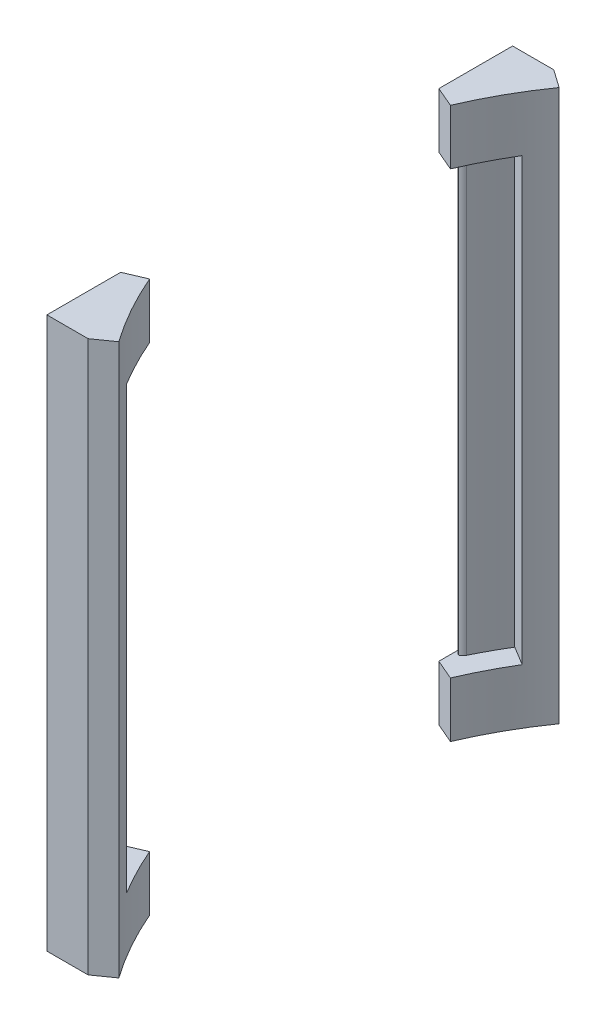
ISO-10303-21;
HEADER;
FILE_DESCRIPTION(('STEP AP214'),'2;1');
FILE_NAME('part.step','',(''),(''),'','','');
FILE_SCHEMA(('AUTOMOTIVE_DESIGN { 1 0 10303 214 1 1 1 1 }'));
ENDSEC;
DATA;
#1=APPLICATION_CONTEXT('core data for automotive mechanical design processes');
#2=APPLICATION_PROTOCOL_DEFINITION('international standard','automotive_design',2000,#1);
#3=PRODUCT_CONTEXT('',#1,'mechanical');
#4=PRODUCT('Part','Part','',(#3));
#5=PRODUCT_RELATED_PRODUCT_CATEGORY('part','',(#4));
#6=PRODUCT_DEFINITION_FORMATION('','',#4);
#7=PRODUCT_DEFINITION_CONTEXT('part definition',#1,'design');
#8=PRODUCT_DEFINITION('design','',#6,#7);
#9=PRODUCT_DEFINITION_SHAPE('','',#8);
#10=(LENGTH_UNIT() NAMED_UNIT(*) SI_UNIT(.MILLI.,.METRE.));
#11=(NAMED_UNIT(*) PLANE_ANGLE_UNIT() SI_UNIT($,.RADIAN.));
#12=(NAMED_UNIT(*) SI_UNIT($,.STERADIAN.) SOLID_ANGLE_UNIT());
#13=UNCERTAINTY_MEASURE_WITH_UNIT(LENGTH_MEASURE(1.E-05),#10,'distance_accuracy_value','');
#14=(GEOMETRIC_REPRESENTATION_CONTEXT(3) GLOBAL_UNCERTAINTY_ASSIGNED_CONTEXT((#13)) GLOBAL_UNIT_ASSIGNED_CONTEXT((#10,
#11,#12)) REPRESENTATION_CONTEXT('',''));
#15=CARTESIAN_POINT('',(0.,0.,0.));
#16=DIRECTION('',(0.,0.,1.));
#17=DIRECTION('',(1.,0.,0.));
#18=AXIS2_PLACEMENT_3D('',#15,#16,#17);
#19=CARTESIAN_POINT('',(0.,37.5,0.));
#20=DIRECTION('',(-0.393701267024399,0.,0.919238441506546));
#21=DIRECTION('',(0.919238441506546,0.,0.393701267024399));
#22=AXIS2_PLACEMENT_3D('',#19,#20,#21);
#23=PLANE('',#22);
#24=DIRECTION('',(0.,-1.,0.));
#25=VECTOR('',#24,1.);
#26=CARTESIAN_POINT('',(-47.8003989583404,37.5,-20.4724658852688));
#27=LINE('',#26,#25);
#28=CARTESIAN_POINT('',(-47.8003989583404,-30.,-20.4724658852688));
#29=VERTEX_POINT('',#28);
#30=CARTESIAN_POINT('',(-47.8003989583404,-37.5,-20.4724658852688));
#31=VERTEX_POINT('',#30);
#32=EDGE_CURVE('E237',#29,#31,#27,.T.);
#33=ORIENTED_EDGE('',*,*,#32,.F.);
#34=DIRECTION('',(-0.919238441506546,0.,-0.393701267024399));
#35=VECTOR('',#34,1.);
#36=CARTESIAN_POINT('',(0.,-30.,0.));
#37=LINE('',#36,#35);
#38=CARTESIAN_POINT('',(-50.55811428286,-30.,-21.653569686342));
#39=VERTEX_POINT('',#38);
#40=EDGE_CURVE('E397',#29,#39,#37,.T.);
#41=ORIENTED_EDGE('',*,*,#40,.T.);
#42=DIRECTION('',(0.,-1.,0.));
#43=VECTOR('',#42,1.);
#44=CARTESIAN_POINT('',(-50.55811428286,37.5,-21.653569686342));
#45=LINE('',#44,#43);
#46=CARTESIAN_POINT('',(-50.55811428286,-37.5,-21.653569686342));
#47=VERTEX_POINT('',#46);
#48=EDGE_CURVE('E166',#39,#47,#45,.T.);
#49=ORIENTED_EDGE('',*,*,#48,.T.);
#50=DIRECTION('',(-0.919238441506546,0.,-0.393701267024399));
#51=VECTOR('',#50,1.);
#52=CARTESIAN_POINT('',(0.,-37.5,0.));
#53=LINE('',#52,#51);
#54=EDGE_CURVE('E223',#31,#47,#53,.T.);
#55=ORIENTED_EDGE('',*,*,#54,.F.);
#56=EDGE_LOOP('',(#33,#41,#49,#55));
#57=FACE_BOUND('',#56,.T.);
#58=ADVANCED_FACE('F53',(#57),#23,.T.);
#59=CARTESIAN_POINT('',(0.,37.5,0.));
#60=DIRECTION('',(0.,-1.,0.));
#61=DIRECTION('',(0.,0.,-1.));
#62=AXIS2_PLACEMENT_3D('',#59,#60,#61);
#63=CYLINDRICAL_SURFACE('',#62,52.);
#64=DIRECTION('',(0.,1.,0.));
#65=VECTOR('',#64,1.);
#66=CARTESIAN_POINT('',(-44.4859922000005,-30.,-26.925759004743));
#67=LINE('',#66,#65);
#68=CARTESIAN_POINT('',(-44.4859922000005,-30.,-26.925759004743));
#69=VERTEX_POINT('',#68);
#70=CARTESIAN_POINT('',(-44.4859922000005,30.,-26.925759004743));
#71=VERTEX_POINT('',#70);
#72=EDGE_CURVE('E201',#69,#71,#67,.T.);
#73=ORIENTED_EDGE('',*,*,#72,.F.);
#74=CARTESIAN_POINT('',(0.,-30.,0.));
#75=DIRECTION('',(0.,1.,0.));
#76=DIRECTION('',(0.,0.,1.));
#77=AXIS2_PLACEMENT_3D('',#74,#75,#76);
#78=CIRCLE('',#77,52.);
#79=EDGE_CURVE('E206',#69,#29,#78,.T.);
#80=ORIENTED_EDGE('',*,*,#79,.T.);
#81=ORIENTED_EDGE('',*,*,#32,.T.);
#82=CARTESIAN_POINT('',(0.,-37.5,0.));
#83=DIRECTION('',(0.,1.,0.));
#84=DIRECTION('',(0.,0.,1.));
#85=AXIS2_PLACEMENT_3D('',#82,#83,#84);
#86=CIRCLE('',#85,52.);
#87=CARTESIAN_POINT('',(-42.4993805578044,-37.5,-29.963355155972));
#88=VERTEX_POINT('',#87);
#89=EDGE_CURVE('E226',#88,#31,#86,.T.);
#90=ORIENTED_EDGE('',*,*,#89,.F.);
#91=DIRECTION('',(0.,-1.,0.));
#92=VECTOR('',#91,1.);
#93=CARTESIAN_POINT('',(-42.4993805578044,37.5,-29.963355155972));
#94=LINE('',#93,#92);
#95=CARTESIAN_POINT('',(-42.4993805578044,37.5,-29.963355155972));
#96=VERTEX_POINT('',#95);
#97=EDGE_CURVE('E236',#96,#88,#94,.T.);
#98=ORIENTED_EDGE('',*,*,#97,.F.);
#99=CARTESIAN_POINT('',(0.,37.5,0.));
#100=DIRECTION('',(0.,1.,0.));
#101=DIRECTION('',(0.,0.,1.));
#102=AXIS2_PLACEMENT_3D('',#99,#100,#101);
#103=CIRCLE('',#102,52.);
#104=CARTESIAN_POINT('',(-47.8003989583404,37.5,-20.4724658852688));
#105=VERTEX_POINT('',#104);
#106=EDGE_CURVE('E211',#96,#105,#103,.T.);
#107=ORIENTED_EDGE('',*,*,#106,.T.);
#108=CARTESIAN_POINT('',(-47.8003989583404,30.,-20.4724658852688));
#109=VERTEX_POINT('',#108);
#110=EDGE_CURVE('E170',#105,#109,#27,.T.);
#111=ORIENTED_EDGE('',*,*,#110,.T.);
#112=CARTESIAN_POINT('',(0.,30.,0.));
#113=DIRECTION('',(0.,1.,0.));
#114=DIRECTION('',(0.,0.,1.));
#115=AXIS2_PLACEMENT_3D('',#112,#113,#114);
#116=CIRCLE('',#115,52.);
#117=EDGE_CURVE('E157',#71,#109,#116,.T.);
#118=ORIENTED_EDGE('',*,*,#117,.F.);
#119=EDGE_LOOP('',(#73,#80,#81,#90,#98,#107,#111,#118));
#120=FACE_BOUND('',#119,.T.);
#121=ADVANCED_FACE('F245',(#120),#63,.F.);
#122=CARTESIAN_POINT('',(-50.55811428286,37.5,0.));
#123=DIRECTION('',(1.,0.,0.));
#124=DIRECTION('',(0.,0.,-1.));
#125=AXIS2_PLACEMENT_3D('',#122,#123,#124);
#126=PLANE('',#125);
#127=DIRECTION('',(0.,0.,1.));
#128=VECTOR('',#127,1.);
#129=CARTESIAN_POINT('',(-50.55811428286,-30.,-23.653569686342));
#130=LINE('',#129,#128);
#131=CARTESIAN_POINT('',(-50.55811428286,-30.,-24.653569686342));
#132=VERTEX_POINT('',#131);
#133=EDGE_CURVE('E151',#132,#39,#130,.T.);
#134=ORIENTED_EDGE('',*,*,#133,.F.);
#135=DIRECTION('',(0.,-1.,0.));
#136=VECTOR('',#135,1.);
#137=CARTESIAN_POINT('',(-50.55811428286,37.5,-24.653569686342));
#138=LINE('',#137,#136);
#139=CARTESIAN_POINT('',(-50.55811428286,30.,-24.653569686342));
#140=VERTEX_POINT('',#139);
#141=EDGE_CURVE('E150',#132,#140,#138,.F.);
#142=ORIENTED_EDGE('',*,*,#141,.T.);
#143=DIRECTION('',(0.,0.,-1.));
#144=VECTOR('',#143,1.);
#145=CARTESIAN_POINT('',(-50.55811428286,30.,-23.653569686342));
#146=LINE('',#145,#144);
#147=CARTESIAN_POINT('',(-50.55811428286,30.,-21.653569686342));
#148=VERTEX_POINT('',#147);
#149=EDGE_CURVE('E142',#148,#140,#146,.T.);
#150=ORIENTED_EDGE('',*,*,#149,.F.);
#151=CARTESIAN_POINT('',(-50.55811428286,37.5,-21.653569686342));
#152=VERTEX_POINT('',#151);
#153=EDGE_CURVE('E147',#152,#148,#45,.T.);
#154=ORIENTED_EDGE('',*,*,#153,.F.);
#155=DIRECTION('',(0.,0.,1.));
#156=VECTOR('',#155,1.);
#157=CARTESIAN_POINT('',(-50.55811428286,37.5,0.));
#158=LINE('',#157,#156);
#159=CARTESIAN_POINT('',(-50.55811428286,37.5,-31.6920102611243));
#160=VERTEX_POINT('',#159);
#161=EDGE_CURVE('E207',#160,#152,#158,.T.);
#162=ORIENTED_EDGE('',*,*,#161,.F.);
#163=DIRECTION('',(0.,-1.,0.));
#164=VECTOR('',#163,1.);
#165=CARTESIAN_POINT('',(-50.55811428286,37.5,-31.6920102611243));
#166=LINE('',#165,#164);
#167=CARTESIAN_POINT('',(-50.55811428286,-37.5,-31.6920102611243));
#168=VERTEX_POINT('',#167);
#169=EDGE_CURVE('E220',#160,#168,#166,.T.);
#170=ORIENTED_EDGE('',*,*,#169,.T.);
#171=DIRECTION('',(0.,0.,1.));
#172=VECTOR('',#171,1.);
#173=CARTESIAN_POINT('',(-50.55811428286,-37.5,0.));
#174=LINE('',#173,#172);
#175=EDGE_CURVE('E204',#168,#47,#174,.T.);
#176=ORIENTED_EDGE('',*,*,#175,.T.);
#177=ORIENTED_EDGE('',*,*,#48,.F.);
#178=EDGE_LOOP('',(#134,#142,#150,#154,#162,#170,#176,#177));
#179=FACE_BOUND('',#178,.T.);
#180=ADVANCED_FACE('F144',(#179),#126,.F.);
#181=DIRECTION('',(-0.919238441506546,0.,-0.393701267024399));
#182=VECTOR('',#181,1.);
#183=CARTESIAN_POINT('',(0.,30.,0.));
#184=LINE('',#183,#182);
#185=EDGE_CURVE('E154',#109,#148,#184,.T.);
#186=ORIENTED_EDGE('',*,*,#185,.F.);
#187=ORIENTED_EDGE('',*,*,#110,.F.);
#188=DIRECTION('',(-0.919238441506546,0.,-0.393701267024399));
#189=VECTOR('',#188,1.);
#190=CARTESIAN_POINT('',(0.,37.5,0.));
#191=LINE('',#190,#189);
#192=EDGE_CURVE('E164',#105,#152,#191,.T.);
#193=ORIENTED_EDGE('',*,*,#192,.T.);
#194=ORIENTED_EDGE('',*,*,#153,.T.);
#195=EDGE_LOOP('',(#186,#187,#193,#194));
#196=FACE_BOUND('',#195,.T.);
#197=ADVANCED_FACE('F162',(#196),#23,.T.);
#198=CARTESIAN_POINT('',(0.,37.5,0.));
#199=DIRECTION('',(0.576218368384078,0.,-0.817295779957777));
#200=DIRECTION('',(-0.817295779957777,0.,-0.576218368384078));
#201=AXIS2_PLACEMENT_3D('',#198,#199,#200);
#202=PLANE('',#201);
#203=DIRECTION('',(0.817295779957777,0.,0.576218368384078));
#204=VECTOR('',#203,1.);
#205=CARTESIAN_POINT('',(0.,-37.5,0.));
#206=LINE('',#205,#204);
#207=CARTESIAN_POINT('',(-44.9512678976777,-37.5,-31.6920102611243));
#208=VERTEX_POINT('',#207);
#209=EDGE_CURVE('E229',#208,#88,#206,.T.);
#210=ORIENTED_EDGE('',*,*,#209,.F.);
#211=DIRECTION('',(0.,-1.,0.));
#212=VECTOR('',#211,1.);
#213=CARTESIAN_POINT('',(-44.9512678976777,37.5,-31.6920102611243));
#214=LINE('',#213,#212);
#215=CARTESIAN_POINT('',(-44.9512678976777,37.5,-31.6920102611243));
#216=VERTEX_POINT('',#215);
#217=EDGE_CURVE('E235',#216,#208,#214,.T.);
#218=ORIENTED_EDGE('',*,*,#217,.F.);
#219=DIRECTION('',(0.817295779957777,0.,0.576218368384078));
#220=VECTOR('',#219,1.);
#221=CARTESIAN_POINT('',(0.,37.5,0.));
#222=LINE('',#221,#220);
#223=EDGE_CURVE('E214',#216,#96,#222,.T.);
#224=ORIENTED_EDGE('',*,*,#223,.T.);
#225=ORIENTED_EDGE('',*,*,#97,.T.);
#226=EDGE_LOOP('',(#210,#218,#224,#225));
#227=FACE_BOUND('',#226,.T.);
#228=ADVANCED_FACE('F258',(#227),#202,.T.);
#229=CARTESIAN_POINT('',(0.,37.5,-31.6920102611243));
#230=DIRECTION('',(0.,0.,-1.));
#231=DIRECTION('',(-1.,0.,0.));
#232=AXIS2_PLACEMENT_3D('',#229,#230,#231);
#233=PLANE('',#232);
#234=DIRECTION('',(1.,0.,0.));
#235=VECTOR('',#234,1.);
#236=CARTESIAN_POINT('',(0.,-37.5,-31.6920102611243));
#237=LINE('',#236,#235);
#238=EDGE_CURVE('E209',#168,#208,#237,.T.);
#239=ORIENTED_EDGE('',*,*,#238,.F.);
#240=ORIENTED_EDGE('',*,*,#169,.F.);
#241=DIRECTION('',(1.,0.,0.));
#242=VECTOR('',#241,1.);
#243=CARTESIAN_POINT('',(0.,37.5,-31.6920102611243));
#244=LINE('',#243,#242);
#245=EDGE_CURVE('E217',#160,#216,#244,.T.);
#246=ORIENTED_EDGE('',*,*,#245,.T.);
#247=ORIENTED_EDGE('',*,*,#217,.T.);
#248=EDGE_LOOP('',(#239,#240,#246,#247));
#249=FACE_BOUND('',#248,.T.);
#250=ADVANCED_FACE('F257',(#249),#233,.T.);
#251=CARTESIAN_POINT('',(0.,37.5,0.));
#252=DIRECTION('',(0.,1.,0.));
#253=DIRECTION('',(0.,0.,1.));
#254=AXIS2_PLACEMENT_3D('',#251,#252,#253);
#255=PLANE('',#254);
#256=ORIENTED_EDGE('',*,*,#161,.T.);
#257=ORIENTED_EDGE('',*,*,#192,.F.);
#258=ORIENTED_EDGE('',*,*,#106,.F.);
#259=ORIENTED_EDGE('',*,*,#223,.F.);
#260=ORIENTED_EDGE('',*,*,#245,.F.);
#261=EDGE_LOOP('',(#256,#257,#258,#259,#260));
#262=FACE_BOUND('',#261,.T.);
#263=ADVANCED_FACE('F248',(#262),#255,.T.);
#264=CARTESIAN_POINT('',(0.,-37.5,0.));
#265=DIRECTION('',(0.,1.,0.));
#266=DIRECTION('',(0.,0.,1.));
#267=AXIS2_PLACEMENT_3D('',#264,#265,#266);
#268=PLANE('',#267);
#269=ORIENTED_EDGE('',*,*,#175,.F.);
#270=ORIENTED_EDGE('',*,*,#238,.T.);
#271=ORIENTED_EDGE('',*,*,#209,.T.);
#272=ORIENTED_EDGE('',*,*,#89,.T.);
#273=ORIENTED_EDGE('',*,*,#54,.T.);
#274=EDGE_LOOP('',(#269,#270,#271,#272,#273));
#275=FACE_BOUND('',#274,.T.);
#276=ADVANCED_FACE('F256',(#275),#268,.F.);
#277=CARTESIAN_POINT('',(0.,-30.,0.));
#278=DIRECTION('',(-0.517803057783519,0.,0.855499850000009));
#279=DIRECTION('',(0.855499850000009,0.,0.517803057783519));
#280=AXIS2_PLACEMENT_3D('',#277,#278,#279);
#281=PLANE('',#280);
#282=DIRECTION('',(0.855499850000009,0.,0.517803057783519));
#283=VECTOR('',#282,1.);
#284=CARTESIAN_POINT('',(0.,30.,0.));
#285=LINE('',#284,#283);
#286=CARTESIAN_POINT('',(-47.0524917500005,30.,-28.4791681780936));
#287=VERTEX_POINT('',#286);
#288=EDGE_CURVE('E194',#287,#71,#285,.T.);
#289=ORIENTED_EDGE('',*,*,#288,.F.);
#290=DIRECTION('',(0.,1.,0.));
#291=VECTOR('',#290,1.);
#292=CARTESIAN_POINT('',(-47.0524917500005,-30.,-28.4791681780936));
#293=LINE('',#292,#291);
#294=CARTESIAN_POINT('',(-47.0524917500005,-30.,-28.4791681780936));
#295=VERTEX_POINT('',#294);
#296=EDGE_CURVE('E192',#295,#287,#293,.T.);
#297=ORIENTED_EDGE('',*,*,#296,.F.);
#298=DIRECTION('',(0.855499850000009,0.,0.517803057783519));
#299=VECTOR('',#298,1.);
#300=CARTESIAN_POINT('',(0.,-30.,0.));
#301=LINE('',#300,#299);
#302=EDGE_CURVE('E200',#295,#69,#301,.T.);
#303=ORIENTED_EDGE('',*,*,#302,.T.);
#304=ORIENTED_EDGE('',*,*,#72,.T.);
#305=EDGE_LOOP('',(#289,#297,#303,#304));
#306=FACE_BOUND('',#305,.T.);
#307=ADVANCED_FACE('F291',(#306),#281,.T.);
#308=CARTESIAN_POINT('',(0.,-30.,0.));
#309=DIRECTION('',(0.,1.,0.));
#310=DIRECTION('',(0.,0.,1.));
#311=AXIS2_PLACEMENT_3D('',#308,#309,#310);
#312=CYLINDRICAL_SURFACE('',#311,55.);
#313=CARTESIAN_POINT('',(0.,30.,0.));
#314=DIRECTION('',(0.,1.,0.));
#315=DIRECTION('',(0.,0.,1.));
#316=AXIS2_PLACEMENT_3D('',#313,#314,#315);
#317=CIRCLE('',#316,55.);
#318=CARTESIAN_POINT('',(-49.3833451443733,30.,-24.2133273705144));
#319=VERTEX_POINT('',#318);
#320=EDGE_CURVE('E160',#287,#319,#317,.T.);
#321=ORIENTED_EDGE('',*,*,#320,.T.);
#322=DIRECTION('',(0.,1.,0.));
#323=VECTOR('',#322,1.);
#324=CARTESIAN_POINT('',(-49.3833451443733,-30.,-24.2133273705144));
#325=LINE('',#324,#323);
#326=CARTESIAN_POINT('',(-49.3833451443733,-30.,-24.2133273705144));
#327=VERTEX_POINT('',#326);
#328=EDGE_CURVE('E165',#319,#327,#325,.F.);
#329=ORIENTED_EDGE('',*,*,#328,.T.);
#330=CARTESIAN_POINT('',(0.,-30.,0.));
#331=DIRECTION('',(0.,1.,0.));
#332=DIRECTION('',(0.,0.,1.));
#333=AXIS2_PLACEMENT_3D('',#330,#331,#332);
#334=CIRCLE('',#333,55.);
#335=EDGE_CURVE('E398',#295,#327,#334,.T.);
#336=ORIENTED_EDGE('',*,*,#335,.F.);
#337=ORIENTED_EDGE('',*,*,#296,.T.);
#338=EDGE_LOOP('',(#321,#329,#336,#337));
#339=FACE_BOUND('',#338,.T.);
#340=ADVANCED_FACE('F190',(#339),#312,.F.);
#341=CARTESIAN_POINT('',(0.,-30.,0.));
#342=DIRECTION('',(0.,1.,0.));
#343=DIRECTION('',(0.,0.,1.));
#344=AXIS2_PLACEMENT_3D('',#341,#342,#343);
#345=PLANE('',#344);
#346=ORIENTED_EDGE('',*,*,#335,.T.);
#347=CARTESIAN_POINT('',(-50.2812241469983,-30.,-24.653569686342));
#348=DIRECTION('',(0.,1.,0.));
#349=DIRECTION('',(0.,0.,1.));
#350=AXIS2_PLACEMENT_3D('',#347,#348,#349);
#351=CIRCLE('',#350,1.);
#352=CARTESIAN_POINT('',(-49.9196692149291,-30.,-23.7212188773133));
#353=VERTEX_POINT('',#352);
#354=EDGE_CURVE('E75',#327,#353,#351,.F.);
#355=ORIENTED_EDGE('',*,*,#354,.T.);
#356=CARTESIAN_POINT('',(-49.55811428286,-30.,-24.653569686342));
#357=DIRECTION('',(0.,1.,0.));
#358=DIRECTION('',(0.,0.,1.));
#359=AXIS2_PLACEMENT_3D('',#356,#357,#358);
#360=CIRCLE('',#359,1.);
#361=EDGE_CURVE('E62',#353,#132,#360,.F.);
#362=ORIENTED_EDGE('',*,*,#361,.T.);
#363=ORIENTED_EDGE('',*,*,#133,.T.);
#364=ORIENTED_EDGE('',*,*,#40,.F.);
#365=ORIENTED_EDGE('',*,*,#79,.F.);
#366=ORIENTED_EDGE('',*,*,#302,.F.);
#367=EDGE_LOOP('',(#346,#355,#362,#363,#364,#365,#366));
#368=FACE_BOUND('',#367,.T.);
#369=ADVANCED_FACE('F178',(#368),#345,.T.);
#370=CARTESIAN_POINT('',(0.,30.,0.));
#371=DIRECTION('',(0.,1.,0.));
#372=DIRECTION('',(0.,0.,1.));
#373=AXIS2_PLACEMENT_3D('',#370,#371,#372);
#374=PLANE('',#373);
#375=ORIENTED_EDGE('',*,*,#117,.T.);
#376=ORIENTED_EDGE('',*,*,#185,.T.);
#377=ORIENTED_EDGE('',*,*,#149,.T.);
#378=CARTESIAN_POINT('',(-49.55811428286,30.,-24.653569686342));
#379=DIRECTION('',(0.,1.,0.));
#380=DIRECTION('',(0.,0.,1.));
#381=AXIS2_PLACEMENT_3D('',#378,#379,#380);
#382=CIRCLE('',#381,1.);
#383=CARTESIAN_POINT('',(-49.9196692149291,30.,-23.7212188773133));
#384=VERTEX_POINT('',#383);
#385=EDGE_CURVE('E12',#140,#384,#382,.T.);
#386=ORIENTED_EDGE('',*,*,#385,.T.);
#387=CARTESIAN_POINT('',(-50.2812241469983,30.,-24.653569686342));
#388=DIRECTION('',(0.,1.,0.));
#389=DIRECTION('',(0.,0.,1.));
#390=AXIS2_PLACEMENT_3D('',#387,#388,#389);
#391=CIRCLE('',#390,1.);
#392=EDGE_CURVE('E176',#384,#319,#391,.T.);
#393=ORIENTED_EDGE('',*,*,#392,.T.);
#394=ORIENTED_EDGE('',*,*,#320,.F.);
#395=ORIENTED_EDGE('',*,*,#288,.T.);
#396=EDGE_LOOP('',(#375,#376,#377,#386,#393,#394,#395));
#397=FACE_BOUND('',#396,.T.);
#398=ADVANCED_FACE('F155',(#397),#374,.F.);
#399=CARTESIAN_POINT('',(-49.55811428286,-30.,-24.653569686342));
#400=DIRECTION('',(0.,-1.,0.));
#401=DIRECTION('',(0.,0.,-1.));
#402=AXIS2_PLACEMENT_3D('',#399,#400,#401);
#403=CYLINDRICAL_SURFACE('',#402,1.);
#404=DIRECTION('',(0.,-1.,0.));
#405=VECTOR('',#404,1.);
#406=CARTESIAN_POINT('',(-49.9196692149291,0.,-23.7212188773133));
#407=LINE('',#406,#405);
#408=EDGE_CURVE('E57',#384,#353,#407,.T.);
#409=ORIENTED_EDGE('',*,*,#408,.F.);
#410=ORIENTED_EDGE('',*,*,#385,.F.);
#411=ORIENTED_EDGE('',*,*,#141,.F.);
#412=ORIENTED_EDGE('',*,*,#361,.F.);
#413=EDGE_LOOP('',(#409,#410,#411,#412));
#414=FACE_BOUND('',#413,.T.);
#415=ADVANCED_FACE('F55',(#414),#403,.T.);
#416=CARTESIAN_POINT('',(-50.2812241469983,-30.,-24.653569686342));
#417=DIRECTION('',(0.,1.,0.));
#418=DIRECTION('',(0.,0.,1.));
#419=AXIS2_PLACEMENT_3D('',#416,#417,#418);
#420=CYLINDRICAL_SURFACE('',#419,1.);
#421=ORIENTED_EDGE('',*,*,#392,.F.);
#422=ORIENTED_EDGE('',*,*,#408,.T.);
#423=ORIENTED_EDGE('',*,*,#354,.F.);
#424=ORIENTED_EDGE('',*,*,#328,.F.);
#425=EDGE_LOOP('',(#421,#422,#423,#424));
#426=FACE_BOUND('',#425,.T.);
#427=ADVANCED_FACE('F186',(#426),#420,.T.);
#428=CLOSED_SHELL('',(#58,#121,#180,#197,#228,#250,#263,#276,#307,#340,#369,#398,#415,#427));
#429=MANIFOLD_SOLID_BREP('B2',#428);
#430=CARTESIAN_POINT('',(0.,37.5,0.));
#431=DIRECTION('',(0.,-1.,0.));
#432=DIRECTION('',(0.,0.,-1.));
#433=AXIS2_PLACEMENT_3D('',#430,#431,#432);
#434=CYLINDRICAL_SURFACE('',#433,52.);
#435=DIRECTION('',(0.,-1.,0.));
#436=VECTOR('',#435,1.);
#437=CARTESIAN_POINT('',(-47.8003989583404,37.5,20.4724658852688));
#438=LINE('',#437,#436);
#439=CARTESIAN_POINT('',(-47.8003989583404,-30.,20.4724658852688));
#440=VERTEX_POINT('',#439);
#441=CARTESIAN_POINT('',(-47.8003989583404,-37.5,20.4724658852688));
#442=VERTEX_POINT('',#441);
#443=EDGE_CURVE('E525',#440,#442,#438,.T.);
#444=ORIENTED_EDGE('',*,*,#443,.F.);
#445=CARTESIAN_POINT('',(0.,-30.,0.));
#446=DIRECTION('',(0.,1.,0.));
#447=DIRECTION('',(0.,0.,1.));
#448=AXIS2_PLACEMENT_3D('',#445,#446,#447);
#449=CIRCLE('',#448,52.);
#450=CARTESIAN_POINT('',(-44.4859922000005,-30.,26.925759004743));
#451=VERTEX_POINT('',#450);
#452=EDGE_CURVE('E511',#440,#451,#449,.T.);
#453=ORIENTED_EDGE('',*,*,#452,.T.);
#454=DIRECTION('',(0.,1.,0.));
#455=VECTOR('',#454,1.);
#456=CARTESIAN_POINT('',(-44.4859922000005,-30.,26.925759004743));
#457=LINE('',#456,#455);
#458=CARTESIAN_POINT('',(-44.4859922000005,30.,26.925759004743));
#459=VERTEX_POINT('',#458);
#460=EDGE_CURVE('E570',#451,#459,#457,.T.);
#461=ORIENTED_EDGE('',*,*,#460,.T.);
#462=CARTESIAN_POINT('',(0.,30.,0.));
#463=DIRECTION('',(0.,1.,0.));
#464=DIRECTION('',(0.,0.,1.));
#465=AXIS2_PLACEMENT_3D('',#462,#463,#464);
#466=CIRCLE('',#465,52.);
#467=CARTESIAN_POINT('',(-47.8003989583404,30.,20.4724658852688));
#468=VERTEX_POINT('',#467);
#469=EDGE_CURVE('E515',#468,#459,#466,.T.);
#470=ORIENTED_EDGE('',*,*,#469,.F.);
#471=CARTESIAN_POINT('',(-47.8003989583404,37.5,20.4724658852688));
#472=VERTEX_POINT('',#471);
#473=EDGE_CURVE('E531',#472,#468,#438,.T.);
#474=ORIENTED_EDGE('',*,*,#473,.F.);
#475=CARTESIAN_POINT('',(0.,37.5,0.));
#476=DIRECTION('',(0.,1.,0.));
#477=DIRECTION('',(0.,0.,1.));
#478=AXIS2_PLACEMENT_3D('',#475,#476,#477);
#479=CIRCLE('',#478,52.);
#480=CARTESIAN_POINT('',(-42.4993805578044,37.5,29.963355155972));
#481=VERTEX_POINT('',#480);
#482=EDGE_CURVE('E526',#472,#481,#479,.T.);
#483=ORIENTED_EDGE('',*,*,#482,.T.);
#484=DIRECTION('',(0.,-1.,0.));
#485=VECTOR('',#484,1.);
#486=CARTESIAN_POINT('',(-42.4993805578044,37.5,29.963355155972));
#487=LINE('',#486,#485);
#488=CARTESIAN_POINT('',(-42.4993805578044,-37.5,29.963355155972));
#489=VERTEX_POINT('',#488);
#490=EDGE_CURVE('E534',#481,#489,#487,.T.);
#491=ORIENTED_EDGE('',*,*,#490,.T.);
#492=CARTESIAN_POINT('',(0.,-37.5,0.));
#493=DIRECTION('',(0.,1.,0.));
#494=DIRECTION('',(0.,0.,1.));
#495=AXIS2_PLACEMENT_3D('',#492,#493,#494);
#496=CIRCLE('',#495,52.);
#497=EDGE_CURVE('E590',#442,#489,#496,.T.);
#498=ORIENTED_EDGE('',*,*,#497,.F.);
#499=EDGE_LOOP('',(#444,#453,#461,#470,#474,#483,#491,#498));
#500=FACE_BOUND('',#499,.T.);
#501=ADVANCED_FACE('F406',(#500),#434,.F.);
#502=CARTESIAN_POINT('',(0.,37.5,0.));
#503=DIRECTION('',(0.3937012670244,0.,0.919238441506545));
#504=DIRECTION('',(0.919238441506545,0.,-0.3937012670244));
#505=AXIS2_PLACEMENT_3D('',#502,#503,#504);
#506=PLANE('',#505);
#507=DIRECTION('',(-0.919238441506545,0.,0.3937012670244));
#508=VECTOR('',#507,1.);
#509=CARTESIAN_POINT('',(0.,-30.,0.));
#510=LINE('',#509,#508);
#511=CARTESIAN_POINT('',(-50.55811428286,-30.,21.653569686342));
#512=VERTEX_POINT('',#511);
#513=EDGE_CURVE('E508',#440,#512,#510,.T.);
#514=ORIENTED_EDGE('',*,*,#513,.F.);
#515=ORIENTED_EDGE('',*,*,#443,.T.);
#516=DIRECTION('',(-0.919238441506545,0.,0.3937012670244));
#517=VECTOR('',#516,1.);
#518=CARTESIAN_POINT('',(0.,-37.5,0.));
#519=LINE('',#518,#517);
#520=CARTESIAN_POINT('',(-50.55811428286,-37.5,21.653569686342));
#521=VERTEX_POINT('',#520);
#522=EDGE_CURVE('E519',#442,#521,#519,.T.);
#523=ORIENTED_EDGE('',*,*,#522,.T.);
#524=DIRECTION('',(0.,-1.,0.));
#525=VECTOR('',#524,1.);
#526=CARTESIAN_POINT('',(-50.55811428286,37.5,21.653569686342));
#527=LINE('',#526,#525);
#528=EDGE_CURVE('E500',#512,#521,#527,.T.);
#529=ORIENTED_EDGE('',*,*,#528,.F.);
#530=EDGE_LOOP('',(#514,#515,#523,#529));
#531=FACE_BOUND('',#530,.T.);
#532=ADVANCED_FACE('F517',(#531),#506,.F.);
#533=CARTESIAN_POINT('',(-50.55811428286,37.5,0.));
#534=DIRECTION('',(1.,0.,0.));
#535=DIRECTION('',(0.,0.,-1.));
#536=AXIS2_PLACEMENT_3D('',#533,#534,#535);
#537=PLANE('',#536);
#538=DIRECTION('',(0.,0.,-1.));
#539=VECTOR('',#538,1.);
#540=CARTESIAN_POINT('',(-50.55811428286,30.,-23.653569686342));
#541=LINE('',#540,#539);
#542=CARTESIAN_POINT('',(-50.55811428286,30.,24.653569686342));
#543=VERTEX_POINT('',#542);
#544=CARTESIAN_POINT('',(-50.55811428286,30.,21.653569686342));
#545=VERTEX_POINT('',#544);
#546=EDGE_CURVE('E505',#543,#545,#541,.T.);
#547=ORIENTED_EDGE('',*,*,#546,.F.);
#548=DIRECTION('',(0.,1.,0.));
#549=VECTOR('',#548,1.);
#550=CARTESIAN_POINT('',(-50.55811428286,37.5,24.653569686342));
#551=LINE('',#550,#549);
#552=CARTESIAN_POINT('',(-50.55811428286,-30.,24.653569686342));
#553=VERTEX_POINT('',#552);
#554=EDGE_CURVE('E503',#543,#553,#551,.F.);
#555=ORIENTED_EDGE('',*,*,#554,.T.);
#556=DIRECTION('',(0.,0.,1.));
#557=VECTOR('',#556,1.);
#558=CARTESIAN_POINT('',(-50.55811428286,-30.,-23.653569686342));
#559=LINE('',#558,#557);
#560=EDGE_CURVE('E495',#512,#553,#559,.T.);
#561=ORIENTED_EDGE('',*,*,#560,.F.);
#562=ORIENTED_EDGE('',*,*,#528,.T.);
#563=DIRECTION('',(0.,0.,1.));
#564=VECTOR('',#563,1.);
#565=CARTESIAN_POINT('',(-50.55811428286,-37.5,0.));
#566=LINE('',#565,#564);
#567=CARTESIAN_POINT('',(-50.55811428286,-37.5,31.6920102611243));
#568=VERTEX_POINT('',#567);
#569=EDGE_CURVE('E573',#521,#568,#566,.T.);
#570=ORIENTED_EDGE('',*,*,#569,.T.);
#571=DIRECTION('',(0.,-1.,0.));
#572=VECTOR('',#571,1.);
#573=CARTESIAN_POINT('',(-50.55811428286,37.5,31.6920102611243));
#574=LINE('',#573,#572);
#575=CARTESIAN_POINT('',(-50.55811428286,37.5,31.6920102611243));
#576=VERTEX_POINT('',#575);
#577=EDGE_CURVE('E539',#576,#568,#574,.T.);
#578=ORIENTED_EDGE('',*,*,#577,.F.);
#579=DIRECTION('',(0.,0.,1.));
#580=VECTOR('',#579,1.);
#581=CARTESIAN_POINT('',(-50.55811428286,37.5,0.));
#582=LINE('',#581,#580);
#583=CARTESIAN_POINT('',(-50.55811428286,37.5,21.653569686342));
#584=VERTEX_POINT('',#583);
#585=EDGE_CURVE('E576',#584,#576,#582,.T.);
#586=ORIENTED_EDGE('',*,*,#585,.F.);
#587=EDGE_CURVE('E521',#584,#545,#527,.T.);
#588=ORIENTED_EDGE('',*,*,#587,.T.);
#589=EDGE_LOOP('',(#547,#555,#561,#562,#570,#578,#586,#588));
#590=FACE_BOUND('',#589,.T.);
#591=ADVANCED_FACE('F497',(#590),#537,.F.);
#592=CARTESIAN_POINT('',(0.,37.5,31.6920102611243));
#593=DIRECTION('',(0.,0.,-1.));
#594=DIRECTION('',(-1.,0.,0.));
#595=AXIS2_PLACEMENT_3D('',#592,#593,#594);
#596=PLANE('',#595);
#597=DIRECTION('',(1.,0.,0.));
#598=VECTOR('',#597,1.);
#599=CARTESIAN_POINT('',(0.,-37.5,31.6920102611243));
#600=LINE('',#599,#598);
#601=CARTESIAN_POINT('',(-44.9512678976777,-37.5,31.6920102611243));
#602=VERTEX_POINT('',#601);
#603=EDGE_CURVE('E586',#568,#602,#600,.T.);
#604=ORIENTED_EDGE('',*,*,#603,.T.);
#605=DIRECTION('',(0.,-1.,0.));
#606=VECTOR('',#605,1.);
#607=CARTESIAN_POINT('',(-44.9512678976777,37.5,31.6920102611243));
#608=LINE('',#607,#606);
#609=CARTESIAN_POINT('',(-44.9512678976777,37.5,31.6920102611243));
#610=VERTEX_POINT('',#609);
#611=EDGE_CURVE('E536',#610,#602,#608,.T.);
#612=ORIENTED_EDGE('',*,*,#611,.F.);
#613=DIRECTION('',(1.,0.,0.));
#614=VECTOR('',#613,1.);
#615=CARTESIAN_POINT('',(0.,37.5,31.6920102611243));
#616=LINE('',#615,#614);
#617=EDGE_CURVE('E579',#576,#610,#616,.T.);
#618=ORIENTED_EDGE('',*,*,#617,.F.);
#619=ORIENTED_EDGE('',*,*,#577,.T.);
#620=EDGE_LOOP('',(#604,#612,#618,#619));
#621=FACE_BOUND('',#620,.T.);
#622=ADVANCED_FACE('F604',(#621),#596,.F.);
#623=CARTESIAN_POINT('',(0.,37.5,0.));
#624=DIRECTION('',(-0.576218368384078,0.,-0.817295779957777));
#625=DIRECTION('',(-0.817295779957777,0.,0.576218368384078));
#626=AXIS2_PLACEMENT_3D('',#623,#624,#625);
#627=PLANE('',#626);
#628=DIRECTION('',(0.817295779957777,0.,-0.576218368384078));
#629=VECTOR('',#628,1.);
#630=CARTESIAN_POINT('',(0.,-37.5,0.));
#631=LINE('',#630,#629);
#632=EDGE_CURVE('E588',#602,#489,#631,.T.);
#633=ORIENTED_EDGE('',*,*,#632,.T.);
#634=ORIENTED_EDGE('',*,*,#490,.F.);
#635=DIRECTION('',(0.817295779957777,0.,-0.576218368384078));
#636=VECTOR('',#635,1.);
#637=CARTESIAN_POINT('',(0.,37.5,0.));
#638=LINE('',#637,#636);
#639=EDGE_CURVE('E581',#610,#481,#638,.T.);
#640=ORIENTED_EDGE('',*,*,#639,.F.);
#641=ORIENTED_EDGE('',*,*,#611,.T.);
#642=EDGE_LOOP('',(#633,#634,#640,#641));
#643=FACE_BOUND('',#642,.T.);
#644=ADVANCED_FACE('F601',(#643),#627,.F.);
#645=ORIENTED_EDGE('',*,*,#473,.T.);
#646=DIRECTION('',(-0.919238441506545,0.,0.3937012670244));
#647=VECTOR('',#646,1.);
#648=CARTESIAN_POINT('',(0.,30.,0.));
#649=LINE('',#648,#647);
#650=EDGE_CURVE('E504',#468,#545,#649,.T.);
#651=ORIENTED_EDGE('',*,*,#650,.T.);
#652=ORIENTED_EDGE('',*,*,#587,.F.);
#653=DIRECTION('',(-0.919238441506545,0.,0.3937012670244));
#654=VECTOR('',#653,1.);
#655=CARTESIAN_POINT('',(0.,37.5,0.));
#656=LINE('',#655,#654);
#657=EDGE_CURVE('E522',#472,#584,#656,.T.);
#658=ORIENTED_EDGE('',*,*,#657,.F.);
#659=EDGE_LOOP('',(#645,#651,#652,#658));
#660=FACE_BOUND('',#659,.T.);
#661=ADVANCED_FACE('F612',(#660),#506,.F.);
#662=CARTESIAN_POINT('',(0.,37.5,0.));
#663=DIRECTION('',(0.,1.,0.));
#664=DIRECTION('',(0.,0.,1.));
#665=AXIS2_PLACEMENT_3D('',#662,#663,#664);
#666=PLANE('',#665);
#667=ORIENTED_EDGE('',*,*,#585,.T.);
#668=ORIENTED_EDGE('',*,*,#617,.T.);
#669=ORIENTED_EDGE('',*,*,#639,.T.);
#670=ORIENTED_EDGE('',*,*,#482,.F.);
#671=ORIENTED_EDGE('',*,*,#657,.T.);
#672=EDGE_LOOP('',(#667,#668,#669,#670,#671));
#673=FACE_BOUND('',#672,.T.);
#674=ADVANCED_FACE('F609',(#673),#666,.T.);
#675=CARTESIAN_POINT('',(0.,-37.5,0.));
#676=DIRECTION('',(0.,1.,0.));
#677=DIRECTION('',(0.,0.,1.));
#678=AXIS2_PLACEMENT_3D('',#675,#676,#677);
#679=PLANE('',#678);
#680=ORIENTED_EDGE('',*,*,#569,.F.);
#681=ORIENTED_EDGE('',*,*,#522,.F.);
#682=ORIENTED_EDGE('',*,*,#497,.T.);
#683=ORIENTED_EDGE('',*,*,#632,.F.);
#684=ORIENTED_EDGE('',*,*,#603,.F.);
#685=EDGE_LOOP('',(#680,#681,#682,#683,#684));
#686=FACE_BOUND('',#685,.T.);
#687=ADVANCED_FACE('F595',(#686),#679,.F.);
#688=CARTESIAN_POINT('',(0.,-30.,0.));
#689=DIRECTION('',(-0.517803057783519,0.,-0.855499850000009));
#690=DIRECTION('',(-0.855499850000009,0.,0.517803057783519));
#691=AXIS2_PLACEMENT_3D('',#688,#689,#690);
#692=PLANE('',#691);
#693=DIRECTION('',(-0.855499850000009,0.,0.517803057783519));
#694=VECTOR('',#693,1.);
#695=CARTESIAN_POINT('',(0.,30.,0.));
#696=LINE('',#695,#694);
#697=CARTESIAN_POINT('',(-47.0524917500005,30.,28.4791681780936));
#698=VERTEX_POINT('',#697);
#699=EDGE_CURVE('E566',#459,#698,#696,.T.);
#700=ORIENTED_EDGE('',*,*,#699,.F.);
#701=ORIENTED_EDGE('',*,*,#460,.F.);
#702=DIRECTION('',(-0.855499850000009,0.,0.517803057783519));
#703=VECTOR('',#702,1.);
#704=CARTESIAN_POINT('',(0.,-30.,0.));
#705=LINE('',#704,#703);
#706=CARTESIAN_POINT('',(-47.0524917500005,-30.,28.4791681780936));
#707=VERTEX_POINT('',#706);
#708=EDGE_CURVE('E558',#451,#707,#705,.T.);
#709=ORIENTED_EDGE('',*,*,#708,.T.);
#710=DIRECTION('',(0.,1.,0.));
#711=VECTOR('',#710,1.);
#712=CARTESIAN_POINT('',(-47.0524917500005,-30.,28.4791681780936));
#713=LINE('',#712,#711);
#714=EDGE_CURVE('E562',#707,#698,#713,.T.);
#715=ORIENTED_EDGE('',*,*,#714,.T.);
#716=EDGE_LOOP('',(#700,#701,#709,#715));
#717=FACE_BOUND('',#716,.T.);
#718=ADVANCED_FACE('F617',(#717),#692,.T.);
#719=CARTESIAN_POINT('',(0.,-30.,0.));
#720=DIRECTION('',(0.,1.,0.));
#721=DIRECTION('',(0.,0.,1.));
#722=AXIS2_PLACEMENT_3D('',#719,#720,#721);
#723=CYLINDRICAL_SURFACE('',#722,55.);
#724=CARTESIAN_POINT('',(0.,-30.,0.));
#725=DIRECTION('',(0.,1.,0.));
#726=DIRECTION('',(0.,0.,1.));
#727=AXIS2_PLACEMENT_3D('',#724,#725,#726);
#728=CIRCLE('',#727,55.);
#729=CARTESIAN_POINT('',(-49.3833451443733,-30.,24.2133273705144));
#730=VERTEX_POINT('',#729);
#731=EDGE_CURVE('E514',#730,#707,#728,.T.);
#732=ORIENTED_EDGE('',*,*,#731,.F.);
#733=DIRECTION('',(0.,1.,0.));
#734=VECTOR('',#733,1.);
#735=CARTESIAN_POINT('',(-49.3833451443733,-30.,24.2133273705144));
#736=LINE('',#735,#734);
#737=CARTESIAN_POINT('',(-49.3833451443733,30.,24.2133273705144));
#738=VERTEX_POINT('',#737);
#739=EDGE_CURVE('E543',#730,#738,#736,.T.);
#740=ORIENTED_EDGE('',*,*,#739,.T.);
#741=CARTESIAN_POINT('',(0.,30.,0.));
#742=DIRECTION('',(0.,1.,0.));
#743=DIRECTION('',(0.,0.,1.));
#744=AXIS2_PLACEMENT_3D('',#741,#742,#743);
#745=CIRCLE('',#744,55.);
#746=EDGE_CURVE('E564',#738,#698,#745,.T.);
#747=ORIENTED_EDGE('',*,*,#746,.T.);
#748=ORIENTED_EDGE('',*,*,#714,.F.);
#749=EDGE_LOOP('',(#732,#740,#747,#748));
#750=FACE_BOUND('',#749,.T.);
#751=ADVANCED_FACE('F622',(#750),#723,.F.);
#752=CARTESIAN_POINT('',(0.,-30.,0.));
#753=DIRECTION('',(0.,1.,0.));
#754=DIRECTION('',(0.,0.,1.));
#755=AXIS2_PLACEMENT_3D('',#752,#753,#754);
#756=PLANE('',#755);
#757=ORIENTED_EDGE('',*,*,#708,.F.);
#758=ORIENTED_EDGE('',*,*,#452,.F.);
#759=ORIENTED_EDGE('',*,*,#513,.T.);
#760=ORIENTED_EDGE('',*,*,#560,.T.);
#761=CARTESIAN_POINT('',(-49.55811428286,-30.,24.653569686342));
#762=DIRECTION('',(0.,1.,0.));
#763=DIRECTION('',(0.,0.,1.));
#764=AXIS2_PLACEMENT_3D('',#761,#762,#763);
#765=CIRCLE('',#764,1.);
#766=CARTESIAN_POINT('',(-49.9196692149291,-30.,23.7212188773133));
#767=VERTEX_POINT('',#766);
#768=EDGE_CURVE('E421',#553,#767,#765,.F.);
#769=ORIENTED_EDGE('',*,*,#768,.T.);
#770=CARTESIAN_POINT('',(-50.2812241469983,-30.,24.653569686342));
#771=DIRECTION('',(0.,1.,0.));
#772=DIRECTION('',(0.,0.,1.));
#773=AXIS2_PLACEMENT_3D('',#770,#771,#772);
#774=CIRCLE('',#773,1.);
#775=EDGE_CURVE('E51',#767,#730,#774,.F.);
#776=ORIENTED_EDGE('',*,*,#775,.T.);
#777=ORIENTED_EDGE('',*,*,#731,.T.);
#778=EDGE_LOOP('',(#757,#758,#759,#760,#769,#776,#777));
#779=FACE_BOUND('',#778,.T.);
#780=ADVANCED_FACE('F510',(#779),#756,.T.);
#781=CARTESIAN_POINT('',(0.,30.,0.));
#782=DIRECTION('',(0.,1.,0.));
#783=DIRECTION('',(0.,0.,1.));
#784=AXIS2_PLACEMENT_3D('',#781,#782,#783);
#785=PLANE('',#784);
#786=ORIENTED_EDGE('',*,*,#746,.F.);
#787=CARTESIAN_POINT('',(-50.2812241469983,30.,24.653569686342));
#788=DIRECTION('',(0.,1.,0.));
#789=DIRECTION('',(0.,0.,1.));
#790=AXIS2_PLACEMENT_3D('',#787,#788,#789);
#791=CIRCLE('',#790,1.);
#792=CARTESIAN_POINT('',(-49.9196692149291,30.,23.7212188773133));
#793=VERTEX_POINT('',#792);
#794=EDGE_CURVE('E415',#738,#793,#791,.T.);
#795=ORIENTED_EDGE('',*,*,#794,.T.);
#796=CARTESIAN_POINT('',(-49.55811428286,30.,24.653569686342));
#797=DIRECTION('',(0.,1.,0.));
#798=DIRECTION('',(0.,0.,1.));
#799=AXIS2_PLACEMENT_3D('',#796,#797,#798);
#800=CIRCLE('',#799,1.);
#801=EDGE_CURVE('E545',#793,#543,#800,.T.);
#802=ORIENTED_EDGE('',*,*,#801,.T.);
#803=ORIENTED_EDGE('',*,*,#546,.T.);
#804=ORIENTED_EDGE('',*,*,#650,.F.);
#805=ORIENTED_EDGE('',*,*,#469,.T.);
#806=ORIENTED_EDGE('',*,*,#699,.T.);
#807=EDGE_LOOP('',(#786,#795,#802,#803,#804,#805,#806));
#808=FACE_BOUND('',#807,.T.);
#809=ADVANCED_FACE('F549',(#808),#785,.F.);
#810=CARTESIAN_POINT('',(-50.2812241469983,-30.,24.653569686342));
#811=DIRECTION('',(0.,1.,0.));
#812=DIRECTION('',(0.,0.,1.));
#813=AXIS2_PLACEMENT_3D('',#810,#811,#812);
#814=CYLINDRICAL_SURFACE('',#813,1.);
#815=ORIENTED_EDGE('',*,*,#739,.F.);
#816=ORIENTED_EDGE('',*,*,#775,.F.);
#817=DIRECTION('',(0.,1.,0.));
#818=VECTOR('',#817,1.);
#819=CARTESIAN_POINT('',(-49.9196692149291,0.,23.7212188773133));
#820=LINE('',#819,#818);
#821=EDGE_CURVE('E410',#793,#767,#820,.F.);
#822=ORIENTED_EDGE('',*,*,#821,.F.);
#823=ORIENTED_EDGE('',*,*,#794,.F.);
#824=EDGE_LOOP('',(#815,#816,#822,#823));
#825=FACE_BOUND('',#824,.T.);
#826=ADVANCED_FACE('F408',(#825),#814,.T.);
#827=CARTESIAN_POINT('',(-49.55811428286,-30.,24.653569686342));
#828=DIRECTION('',(0.,1.,0.));
#829=DIRECTION('',(0.,0.,1.));
#830=AXIS2_PLACEMENT_3D('',#827,#828,#829);
#831=CYLINDRICAL_SURFACE('',#830,1.);
#832=ORIENTED_EDGE('',*,*,#768,.F.);
#833=ORIENTED_EDGE('',*,*,#554,.F.);
#834=ORIENTED_EDGE('',*,*,#801,.F.);
#835=ORIENTED_EDGE('',*,*,#821,.T.);
#836=EDGE_LOOP('',(#832,#833,#834,#835));
#837=FACE_BOUND('',#836,.T.);
#838=ADVANCED_FACE('F553',(#837),#831,.T.);
#839=CLOSED_SHELL('',(#501,#532,#591,#622,#644,#661,#674,#687,#718,#751,#780,#809,#826,#838));
#840=MANIFOLD_SOLID_BREP('B6',#839);
#841=ADVANCED_BREP_SHAPE_REPRESENTATION('',(#18,#429,#840),#14);
#842=SHAPE_DEFINITION_REPRESENTATION(#9,#841);
ENDSEC;
END-ISO-10303-21;
